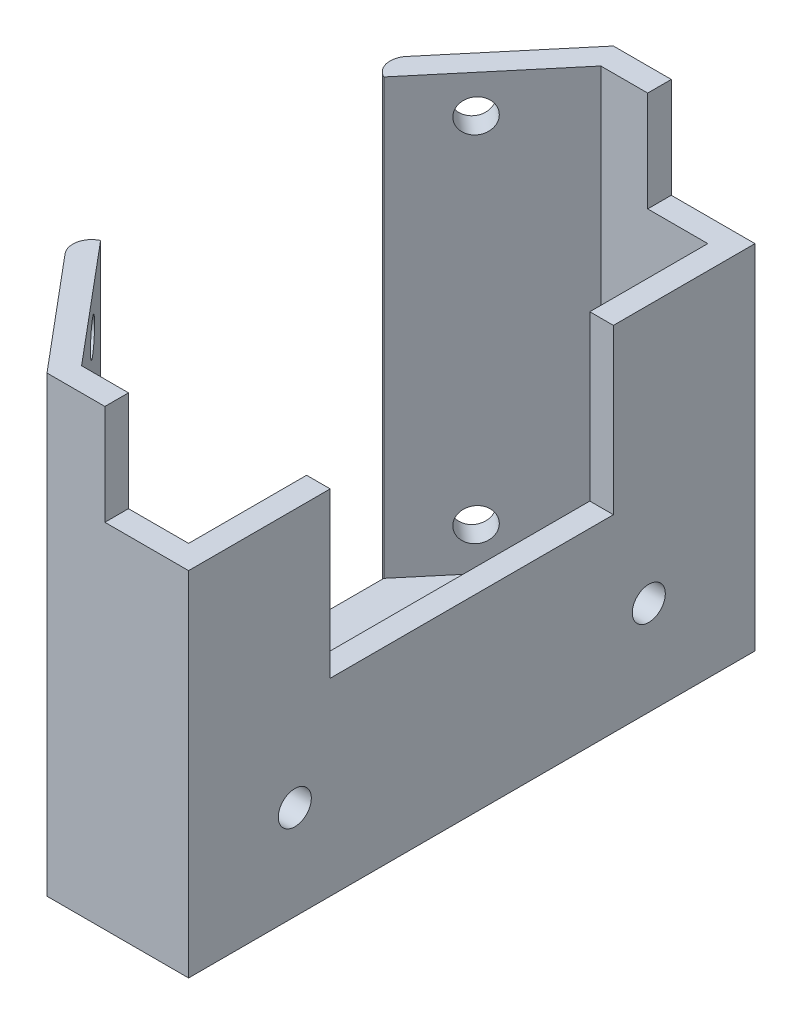
ISO-10303-21;
HEADER;
FILE_DESCRIPTION(('STEP AP214'),'2;1');
FILE_NAME('part.step','',(''),(''),'','','');
FILE_SCHEMA(('AUTOMOTIVE_DESIGN { 1 0 10303 214 1 1 1 1 }'));
ENDSEC;
DATA;
#1=APPLICATION_CONTEXT('core data for automotive mechanical design processes');
#2=APPLICATION_PROTOCOL_DEFINITION('international standard','automotive_design',2000,#1);
#3=PRODUCT_CONTEXT('',#1,'mechanical');
#4=PRODUCT('Part','Part','',(#3));
#5=PRODUCT_RELATED_PRODUCT_CATEGORY('part','',(#4));
#6=PRODUCT_DEFINITION_FORMATION('','',#4);
#7=PRODUCT_DEFINITION_CONTEXT('part definition',#1,'design');
#8=PRODUCT_DEFINITION('design','',#6,#7);
#9=PRODUCT_DEFINITION_SHAPE('','',#8);
#10=(LENGTH_UNIT() NAMED_UNIT(*) SI_UNIT(.MILLI.,.METRE.));
#11=(NAMED_UNIT(*) PLANE_ANGLE_UNIT() SI_UNIT($,.RADIAN.));
#12=(NAMED_UNIT(*) SI_UNIT($,.STERADIAN.) SOLID_ANGLE_UNIT());
#13=UNCERTAINTY_MEASURE_WITH_UNIT(LENGTH_MEASURE(1.E-05),#10,'distance_accuracy_value','');
#14=(GEOMETRIC_REPRESENTATION_CONTEXT(3) GLOBAL_UNCERTAINTY_ASSIGNED_CONTEXT((#13)) GLOBAL_UNIT_ASSIGNED_CONTEXT((#10,
#11,#12)) REPRESENTATION_CONTEXT('',''));
#15=CARTESIAN_POINT('',(0.,0.,0.));
#16=DIRECTION('',(0.,0.,1.));
#17=DIRECTION('',(1.,0.,0.));
#18=AXIS2_PLACEMENT_3D('',#15,#16,#17);
#19=CARTESIAN_POINT('',(-19.1732969614341,55.,16.0883064087919));
#20=DIRECTION('',(0.766044443118976,0.,-0.642787609686541));
#21=DIRECTION('',(-0.642787609686541,0.,-0.766044443118977));
#22=AXIS2_PLACEMENT_3D('',#19,#20,#21);
#23=PLANE('',#22);
#24=CARTESIAN_POINT('',(-14.279396449961,44.,21.9206299251385));
#25=DIRECTION('',(-0.766044443118976,0.,0.642787609686541));
#26=DIRECTION('',(0.642787609686541,0.,0.766044443118976));
#27=AXIS2_PLACEMENT_3D('',#24,#25,#26);
#28=CIRCLE('',#27,1.75);
#29=CARTESIAN_POINT('',(-13.1545181330096,44.,23.2612077005967));
#30=VERTEX_POINT('',#29);
#31=EDGE_CURVE('E239',#30,#30,#28,.T.);
#32=ORIENTED_EDGE('',*,*,#31,.F.);
#33=EDGE_LOOP('',(#32));
#34=FACE_BOUND('',#33,.T.);
#35=DIRECTION('',(0.,-1.,0.));
#36=VECTOR('',#35,1.);
#37=CARTESIAN_POINT('',(-7.49999999999999,55.,30.));
#38=LINE('',#37,#36);
#39=CARTESIAN_POINT('',(-7.49999999999999,48.,30.));
#40=VERTEX_POINT('',#39);
#41=CARTESIAN_POINT('',(-7.49999999999999,0.,30.));
#42=VERTEX_POINT('',#41);
#43=EDGE_CURVE('E326',#40,#42,#38,.T.);
#44=ORIENTED_EDGE('',*,*,#43,.F.);
#45=DIRECTION('',(-0.642787609686541,0.,-0.766044443118977));
#46=VECTOR('',#45,1.);
#47=CARTESIAN_POINT('',(-19.1732969614341,48.,16.0883064087919));
#48=LINE('',#47,#46);
#49=CARTESIAN_POINT('',(-17.4933344983938,48.,18.0904077095436));
#50=VERTEX_POINT('',#49);
#51=EDGE_CURVE('E197',#40,#50,#48,.T.);
#52=ORIENTED_EDGE('',*,*,#51,.T.);
#53=DIRECTION('',(0.,1.,0.));
#54=VECTOR('',#53,1.);
#55=CARTESIAN_POINT('',(-17.4933344983938,55.,18.0904077095436));
#56=LINE('',#55,#54);
#57=CARTESIAN_POINT('',(-17.4933344983938,0.,18.0904077095436));
#58=VERTEX_POINT('',#57);
#59=EDGE_CURVE('E333',#50,#58,#56,.F.);
#60=ORIENTED_EDGE('',*,*,#59,.T.);
#61=DIRECTION('',(0.642787609686541,0.,0.766044443118976));
#62=VECTOR('',#61,1.);
#63=CARTESIAN_POINT('',(-19.1732969614341,0.,16.0883064087919));
#64=LINE('',#63,#62);
#65=EDGE_CURVE('E308',#58,#42,#64,.T.);
#66=ORIENTED_EDGE('',*,*,#65,.T.);
#67=EDGE_LOOP('',(#44,#52,#60,#66));
#68=FACE_BOUND('',#67,.T.);
#69=CARTESIAN_POINT('',(-14.9221840596476,6.51333570454687,21.1545854820195));
#70=DIRECTION('',(0.766044443118976,0.,-0.642787609686541));
#71=DIRECTION('',(-0.642787609686541,0.,-0.766044443118976));
#72=AXIS2_PLACEMENT_3D('',#69,#70,#71);
#73=CIRCLE('',#72,1.75);
#74=CARTESIAN_POINT('',(-16.047062376599,6.51333570454687,19.8140077065613));
#75=VERTEX_POINT('',#74);
#76=EDGE_CURVE('E243',#75,#75,#73,.T.);
#77=ORIENTED_EDGE('',*,*,#76,.T.);
#78=EDGE_LOOP('',(#77));
#79=FACE_BOUND('',#78,.T.);
#80=ADVANCED_FACE('F36',(#34,#68,#79),#23,.F.);
#81=CARTESIAN_POINT('',(-17.2581858536367,2.,14.4813373845755));
#82=DIRECTION('',(-0.766044443118977,0.,0.642787609686541));
#83=DIRECTION('',(0.642787609686541,0.,0.766044443118977));
#84=AXIS2_PLACEMENT_3D('',#81,#82,#83);
#85=PLANE('',#84);
#86=CARTESIAN_POINT('',(-12.3642853421636,44.,20.3136609009222));
#87=DIRECTION('',(-0.766044443118977,0.,0.642787609686541));
#88=DIRECTION('',(0.642787609686541,0.,0.766044443118977));
#89=AXIS2_PLACEMENT_3D('',#86,#87,#88);
#90=CIRCLE('',#89,1.75);
#91=CARTESIAN_POINT('',(-11.2394070252122,44.,21.6542386763804));
#92=VERTEX_POINT('',#91);
#93=EDGE_CURVE('E242',#92,#92,#90,.T.);
#94=ORIENTED_EDGE('',*,*,#93,.T.);
#95=EDGE_LOOP('',(#94));
#96=FACE_BOUND('',#95,.T.);
#97=DIRECTION('',(0.,1.,0.));
#98=VECTOR('',#97,1.);
#99=CARTESIAN_POINT('',(-16.8229762443285,2.,15.));
#100=LINE('',#99,#98);
#101=CARTESIAN_POINT('',(-16.8229762443285,2.,15.));
#102=VERTEX_POINT('',#101);
#103=CARTESIAN_POINT('',(-16.8229762443285,48.,15.));
#104=VERTEX_POINT('',#103);
#105=EDGE_CURVE('E328',#102,#104,#100,.T.);
#106=ORIENTED_EDGE('',*,*,#105,.T.);
#107=DIRECTION('',(0.642787609686541,0.,0.766044443118977));
#108=VECTOR('',#107,1.);
#109=CARTESIAN_POINT('',(-17.2581858536367,48.,14.4813373845755));
#110=LINE('',#109,#108);
#111=CARTESIAN_POINT('',(-6.3342308546125,48.,27.5));
#112=VERTEX_POINT('',#111);
#113=EDGE_CURVE('E217',#104,#112,#110,.T.);
#114=ORIENTED_EDGE('',*,*,#113,.T.);
#115=DIRECTION('',(0.,1.,0.));
#116=VECTOR('',#115,1.);
#117=CARTESIAN_POINT('',(-6.3342308546125,2.,27.5));
#118=LINE('',#117,#116);
#119=CARTESIAN_POINT('',(-6.3342308546125,2.,27.5));
#120=VERTEX_POINT('',#119);
#121=EDGE_CURVE('E293',#120,#112,#118,.T.);
#122=ORIENTED_EDGE('',*,*,#121,.F.);
#123=DIRECTION('',(0.642787609686541,0.,0.766044443118977));
#124=VECTOR('',#123,1.);
#125=CARTESIAN_POINT('',(-17.2581858536367,2.,14.4813373845755));
#126=LINE('',#125,#124);
#127=EDGE_CURVE('E283',#102,#120,#126,.T.);
#128=ORIENTED_EDGE('',*,*,#127,.F.);
#129=EDGE_LOOP('',(#106,#114,#122,#128));
#130=FACE_BOUND('',#129,.T.);
#131=CARTESIAN_POINT('',(-13.0070729518501,6.51333570454687,19.5476164578032));
#132=DIRECTION('',(-0.766044443118977,0.,0.642787609686541));
#133=DIRECTION('',(0.642787609686541,0.,0.766044443118977));
#134=AXIS2_PLACEMENT_3D('',#131,#132,#133);
#135=CIRCLE('',#134,1.75);
#136=CARTESIAN_POINT('',(-11.8821946348987,6.51333570454687,20.8881942332614));
#137=VERTEX_POINT('',#136);
#138=EDGE_CURVE('E246',#137,#137,#135,.F.);
#139=ORIENTED_EDGE('',*,*,#138,.F.);
#140=EDGE_LOOP('',(#139));
#141=FACE_BOUND('',#140,.T.);
#142=ADVANCED_FACE('F389',(#96,#130,#141),#85,.F.);
#143=CARTESIAN_POINT('',(-19.1732969614341,55.,-16.0883064087919));
#144=DIRECTION('',(0.766044443118977,0.,0.642787609686541));
#145=DIRECTION('',(0.642787609686541,0.,-0.766044443118977));
#146=AXIS2_PLACEMENT_3D('',#143,#144,#145);
#147=PLANE('',#146);
#148=CARTESIAN_POINT('',(-14.2793964499611,6.5,-21.9206299251385));
#149=DIRECTION('',(-0.766044443118977,0.,-0.642787609686541));
#150=DIRECTION('',(-0.642787609686541,0.,0.766044443118977));
#151=AXIS2_PLACEMENT_3D('',#148,#149,#150);
#152=CIRCLE('',#151,1.75);
#153=CARTESIAN_POINT('',(-15.4042747669125,6.5,-20.5800521496803));
#154=VERTEX_POINT('',#153);
#155=EDGE_CURVE('E231',#154,#154,#152,.T.);
#156=ORIENTED_EDGE('',*,*,#155,.F.);
#157=EDGE_LOOP('',(#156));
#158=FACE_BOUND('',#157,.T.);
#159=CARTESIAN_POINT('',(-14.2793964499611,44.,-21.9206299251385));
#160=DIRECTION('',(-0.766044443118977,0.,-0.642787609686541));
#161=DIRECTION('',(-0.642787609686541,0.,0.766044443118977));
#162=AXIS2_PLACEMENT_3D('',#159,#160,#161);
#163=CIRCLE('',#162,1.75000000000001);
#164=CARTESIAN_POINT('',(-15.4042747669125,44.,-20.5800521496803));
#165=VERTEX_POINT('',#164);
#166=EDGE_CURVE('E235',#165,#165,#163,.T.);
#167=ORIENTED_EDGE('',*,*,#166,.F.);
#168=EDGE_LOOP('',(#167));
#169=FACE_BOUND('',#168,.T.);
#170=DIRECTION('',(0.,-1.,0.));
#171=VECTOR('',#170,1.);
#172=CARTESIAN_POINT('',(-17.4933344983938,55.,-18.0904077095436));
#173=LINE('',#172,#171);
#174=CARTESIAN_POINT('',(-17.4933344983938,0.,-18.0904077095436));
#175=VERTEX_POINT('',#174);
#176=CARTESIAN_POINT('',(-17.4933344983938,48.,-18.0904077095436));
#177=VERTEX_POINT('',#176);
#178=EDGE_CURVE('E339',#175,#177,#173,.F.);
#179=ORIENTED_EDGE('',*,*,#178,.T.);
#180=DIRECTION('',(0.642787609686541,0.,-0.766044443118977));
#181=VECTOR('',#180,1.);
#182=CARTESIAN_POINT('',(-19.1732969614341,48.,-16.0883064087919));
#183=LINE('',#182,#181);
#184=CARTESIAN_POINT('',(-7.49999999999999,48.,-30.));
#185=VERTEX_POINT('',#184);
#186=EDGE_CURVE('E210',#177,#185,#183,.T.);
#187=ORIENTED_EDGE('',*,*,#186,.T.);
#188=DIRECTION('',(0.,-1.,0.));
#189=VECTOR('',#188,1.);
#190=CARTESIAN_POINT('',(-7.49999999999999,55.,-30.));
#191=LINE('',#190,#189);
#192=CARTESIAN_POINT('',(-7.49999999999999,0.,-30.));
#193=VERTEX_POINT('',#192);
#194=EDGE_CURVE('E320',#185,#193,#191,.T.);
#195=ORIENTED_EDGE('',*,*,#194,.T.);
#196=DIRECTION('',(-0.642787609686541,0.,0.766044443118977));
#197=VECTOR('',#196,1.);
#198=CARTESIAN_POINT('',(-19.1732969614341,0.,-16.0883064087919));
#199=LINE('',#198,#197);
#200=EDGE_CURVE('E297',#193,#175,#199,.T.);
#201=ORIENTED_EDGE('',*,*,#200,.T.);
#202=EDGE_LOOP('',(#179,#187,#195,#201));
#203=FACE_BOUND('',#202,.T.);
#204=ADVANCED_FACE('F412',(#158,#169,#203),#147,.F.);
#205=CARTESIAN_POINT('',(0.,55.,30.));
#206=DIRECTION('',(0.,0.,-1.));
#207=DIRECTION('',(-1.,0.,0.));
#208=AXIS2_PLACEMENT_3D('',#205,#206,#207);
#209=PLANE('',#208);
#210=DIRECTION('',(0.,-1.,0.));
#211=VECTOR('',#210,1.);
#212=CARTESIAN_POINT('',(7.5,55.,30.));
#213=LINE('',#212,#211);
#214=CARTESIAN_POINT('',(7.50000000000001,37.3717761098646,30.));
#215=VERTEX_POINT('',#214);
#216=CARTESIAN_POINT('',(7.5,0.,30.));
#217=VERTEX_POINT('',#216);
#218=EDGE_CURVE('E324',#215,#217,#213,.T.);
#219=ORIENTED_EDGE('',*,*,#218,.F.);
#220=DIRECTION('',(1.,0.,0.));
#221=VECTOR('',#220,1.);
#222=CARTESIAN_POINT('',(-1.36754643088466,37.3717761098646,30.));
#223=LINE('',#222,#221);
#224=CARTESIAN_POINT('',(-1.36754643088466,37.3717761098646,30.));
#225=VERTEX_POINT('',#224);
#226=EDGE_CURVE('E193',#225,#215,#223,.T.);
#227=ORIENTED_EDGE('',*,*,#226,.F.);
#228=DIRECTION('',(0.,-1.,0.));
#229=VECTOR('',#228,1.);
#230=CARTESIAN_POINT('',(-1.36754643088466,48.,30.));
#231=LINE('',#230,#229);
#232=CARTESIAN_POINT('',(-1.36754643088466,48.,30.));
#233=VERTEX_POINT('',#232);
#234=EDGE_CURVE('E181',#233,#225,#231,.T.);
#235=ORIENTED_EDGE('',*,*,#234,.F.);
#236=DIRECTION('',(1.,0.,0.));
#237=VECTOR('',#236,1.);
#238=CARTESIAN_POINT('',(-17.9612456121558,48.,30.));
#239=LINE('',#238,#237);
#240=EDGE_CURVE('E191',#40,#233,#239,.T.);
#241=ORIENTED_EDGE('',*,*,#240,.F.);
#242=ORIENTED_EDGE('',*,*,#43,.T.);
#243=DIRECTION('',(1.,0.,0.));
#244=VECTOR('',#243,1.);
#245=CARTESIAN_POINT('',(0.,0.,30.));
#246=LINE('',#245,#244);
#247=EDGE_CURVE('E311',#42,#217,#246,.T.);
#248=ORIENTED_EDGE('',*,*,#247,.T.);
#249=EDGE_LOOP('',(#219,#227,#235,#241,#242,#248));
#250=FACE_BOUND('',#249,.T.);
#251=ADVANCED_FACE('F190',(#250),#209,.F.);
#252=CARTESIAN_POINT('',(7.5,55.,0.));
#253=DIRECTION('',(1.,0.,0.));
#254=DIRECTION('',(0.,0.,-1.));
#255=AXIS2_PLACEMENT_3D('',#252,#253,#254);
#256=PLANE('',#255);
#257=DIRECTION('',(0.,0.,1.));
#258=VECTOR('',#257,1.);
#259=CARTESIAN_POINT('',(7.50000000000001,37.3717761098646,-48.));
#260=LINE('',#259,#258);
#261=CARTESIAN_POINT('',(7.50000000000001,37.3717761098646,15.));
#262=VERTEX_POINT('',#261);
#263=EDGE_CURVE('E421',#262,#215,#260,.T.);
#264=ORIENTED_EDGE('',*,*,#263,.T.);
#265=ORIENTED_EDGE('',*,*,#218,.T.);
#266=DIRECTION('',(0.,0.,1.));
#267=VECTOR('',#266,1.);
#268=CARTESIAN_POINT('',(7.5,0.,0.));
#269=LINE('',#268,#267);
#270=CARTESIAN_POINT('',(7.50000000000001,0.,-30.));
#271=VERTEX_POINT('',#270);
#272=EDGE_CURVE('E314',#271,#217,#269,.T.);
#273=ORIENTED_EDGE('',*,*,#272,.F.);
#274=DIRECTION('',(0.,-1.,0.));
#275=VECTOR('',#274,1.);
#276=CARTESIAN_POINT('',(7.50000000000001,55.,-30.));
#277=LINE('',#276,#275);
#278=CARTESIAN_POINT('',(7.50000000000001,37.3717761098646,-30.));
#279=VERTEX_POINT('',#278);
#280=EDGE_CURVE('E322',#279,#271,#277,.T.);
#281=ORIENTED_EDGE('',*,*,#280,.F.);
#282=CARTESIAN_POINT('',(7.50000000000001,37.3717761098646,-15.));
#283=VERTEX_POINT('',#282);
#284=EDGE_CURVE('E718',#279,#283,#260,.T.);
#285=ORIENTED_EDGE('',*,*,#284,.T.);
#286=DIRECTION('',(0.,1.,0.));
#287=VECTOR('',#286,1.);
#288=CARTESIAN_POINT('',(7.5,55.,-15.));
#289=LINE('',#288,#287);
#290=CARTESIAN_POINT('',(7.5,20.,-15.));
#291=VERTEX_POINT('',#290);
#292=EDGE_CURVE('E278',#291,#283,#289,.T.);
#293=ORIENTED_EDGE('',*,*,#292,.F.);
#294=DIRECTION('',(0.,0.,1.));
#295=VECTOR('',#294,1.);
#296=CARTESIAN_POINT('',(7.5,20.,0.));
#297=LINE('',#296,#295);
#298=CARTESIAN_POINT('',(7.5,20.,15.));
#299=VERTEX_POINT('',#298);
#300=EDGE_CURVE('E267',#291,#299,#297,.T.);
#301=ORIENTED_EDGE('',*,*,#300,.T.);
#302=DIRECTION('',(0.,-1.,0.));
#303=VECTOR('',#302,1.);
#304=CARTESIAN_POINT('',(7.5,55.,15.));
#305=LINE('',#304,#303);
#306=EDGE_CURVE('E273',#262,#299,#305,.T.);
#307=ORIENTED_EDGE('',*,*,#306,.F.);
#308=EDGE_LOOP('',(#264,#265,#273,#281,#285,#293,#301,#307));
#309=FACE_BOUND('',#308,.T.);
#310=CARTESIAN_POINT('',(7.5,10.,18.75));
#311=DIRECTION('',(1.,0.,0.));
#312=DIRECTION('',(0.,0.,1.));
#313=AXIS2_PLACEMENT_3D('',#310,#311,#312);
#314=CIRCLE('',#313,1.75);
#315=CARTESIAN_POINT('',(7.5,10.,20.5));
#316=VERTEX_POINT('',#315);
#317=EDGE_CURVE('E223',#316,#316,#314,.T.);
#318=ORIENTED_EDGE('',*,*,#317,.F.);
#319=EDGE_LOOP('',(#318));
#320=FACE_BOUND('',#319,.T.);
#321=CARTESIAN_POINT('',(7.5,10.,-18.75));
#322=DIRECTION('',(1.,0.,0.));
#323=DIRECTION('',(0.,0.,-1.));
#324=AXIS2_PLACEMENT_3D('',#321,#322,#323);
#325=CIRCLE('',#324,1.75);
#326=CARTESIAN_POINT('',(7.5,10.,-20.5));
#327=VERTEX_POINT('',#326);
#328=EDGE_CURVE('E227',#327,#327,#325,.T.);
#329=ORIENTED_EDGE('',*,*,#328,.F.);
#330=EDGE_LOOP('',(#329));
#331=FACE_BOUND('',#330,.T.);
#332=ADVANCED_FACE('F417',(#309,#320,#331),#256,.T.);
#333=CARTESIAN_POINT('',(0.,55.,-30.));
#334=DIRECTION('',(0.,0.,-1.));
#335=DIRECTION('',(-1.,0.,0.));
#336=AXIS2_PLACEMENT_3D('',#333,#334,#335);
#337=PLANE('',#336);
#338=DIRECTION('',(-1.,0.,0.));
#339=VECTOR('',#338,1.);
#340=CARTESIAN_POINT('',(0.,37.3717761098646,-30.));
#341=LINE('',#340,#339);
#342=CARTESIAN_POINT('',(-1.36754643088466,37.3717761098646,-30.));
#343=VERTEX_POINT('',#342);
#344=EDGE_CURVE('E716',#279,#343,#341,.T.);
#345=ORIENTED_EDGE('',*,*,#344,.F.);
#346=ORIENTED_EDGE('',*,*,#280,.T.);
#347=DIRECTION('',(1.,0.,0.));
#348=VECTOR('',#347,1.);
#349=CARTESIAN_POINT('',(0.,0.,-30.));
#350=LINE('',#349,#348);
#351=EDGE_CURVE('E317',#193,#271,#350,.T.);
#352=ORIENTED_EDGE('',*,*,#351,.F.);
#353=ORIENTED_EDGE('',*,*,#194,.F.);
#354=DIRECTION('',(1.,0.,0.));
#355=VECTOR('',#354,1.);
#356=CARTESIAN_POINT('',(-17.9612456121558,48.,-30.));
#357=LINE('',#356,#355);
#358=CARTESIAN_POINT('',(-1.36754643088466,48.,-30.));
#359=VERTEX_POINT('',#358);
#360=EDGE_CURVE('E198',#185,#359,#357,.T.);
#361=ORIENTED_EDGE('',*,*,#360,.T.);
#362=DIRECTION('',(0.,1.,0.));
#363=VECTOR('',#362,1.);
#364=CARTESIAN_POINT('',(-1.36754643088466,55.,-30.));
#365=LINE('',#364,#363);
#366=EDGE_CURVE('E51',#343,#359,#365,.T.);
#367=ORIENTED_EDGE('',*,*,#366,.F.);
#368=EDGE_LOOP('',(#345,#346,#352,#353,#361,#367));
#369=FACE_BOUND('',#368,.T.);
#370=ADVANCED_FACE('F409',(#369),#337,.T.);
#371=CARTESIAN_POINT('',(0.,0.,0.));
#372=DIRECTION('',(0.,1.,0.));
#373=DIRECTION('',(0.,0.,1.));
#374=AXIS2_PLACEMENT_3D('',#371,#372,#373);
#375=PLANE('',#374);
#376=CARTESIAN_POINT('',(-0.667115427306265,0.,-23.5));
#377=DIRECTION('',(0.,1.,0.));
#378=DIRECTION('',(0.,0.,1.));
#379=AXIS2_PLACEMENT_3D('',#376,#377,#378);
#380=CIRCLE('',#379,1.75);
#381=CARTESIAN_POINT('',(-0.667115427306265,0.,-21.75));
#382=VERTEX_POINT('',#381);
#383=EDGE_CURVE('E739',#382,#382,#380,.T.);
#384=ORIENTED_EDGE('',*,*,#383,.T.);
#385=EDGE_LOOP('',(#384));
#386=FACE_BOUND('',#385,.T.);
#387=CARTESIAN_POINT('',(-0.667115427306259,0.,23.5));
#388=DIRECTION('',(0.,1.,0.));
#389=DIRECTION('',(0.,0.,1.));
#390=AXIS2_PLACEMENT_3D('',#387,#388,#389);
#391=CIRCLE('',#390,1.75);
#392=CARTESIAN_POINT('',(-0.667115427306259,0.,25.25));
#393=VERTEX_POINT('',#392);
#394=EDGE_CURVE('E199',#393,#393,#391,.T.);
#395=ORIENTED_EDGE('',*,*,#394,.T.);
#396=EDGE_LOOP('',(#395));
#397=FACE_BOUND('',#396,.T.);
#398=ORIENTED_EDGE('',*,*,#65,.F.);
#399=CARTESIAN_POINT('',(-15.9612456121558,0.,16.8048324901705));
#400=DIRECTION('',(0.,1.,0.));
#401=DIRECTION('',(0.,0.,1.));
#402=AXIS2_PLACEMENT_3D('',#399,#400,#401);
#403=CIRCLE('',#402,2.);
#404=CARTESIAN_POINT('',(-16.8229762443285,0.,15.));
#405=VERTEX_POINT('',#404);
#406=EDGE_CURVE('E337',#58,#405,#403,.F.);
#407=ORIENTED_EDGE('',*,*,#406,.T.);
#408=DIRECTION('',(0.,0.,-1.));
#409=VECTOR('',#408,1.);
#410=CARTESIAN_POINT('',(-16.8229762443285,0.,0.));
#411=LINE('',#410,#409);
#412=CARTESIAN_POINT('',(-16.8229762443285,0.,-15.));
#413=VERTEX_POINT('',#412);
#414=EDGE_CURVE('E255',#405,#413,#411,.T.);
#415=ORIENTED_EDGE('',*,*,#414,.T.);
#416=CARTESIAN_POINT('',(-15.9612456121558,0.,-16.8048324901705));
#417=DIRECTION('',(0.,1.,0.));
#418=DIRECTION('',(0.,0.,1.));
#419=AXIS2_PLACEMENT_3D('',#416,#417,#418);
#420=CIRCLE('',#419,2.);
#421=EDGE_CURVE('E335',#413,#175,#420,.F.);
#422=ORIENTED_EDGE('',*,*,#421,.T.);
#423=ORIENTED_EDGE('',*,*,#200,.F.);
#424=ORIENTED_EDGE('',*,*,#351,.T.);
#425=ORIENTED_EDGE('',*,*,#272,.T.);
#426=ORIENTED_EDGE('',*,*,#247,.F.);
#427=EDGE_LOOP('',(#398,#407,#415,#422,#423,#424,#425,#426));
#428=FACE_BOUND('',#427,.T.);
#429=ADVANCED_FACE('F374',(#386,#397,#428),#375,.F.);
#430=CARTESIAN_POINT('',(-17.2581858536367,2.,-14.4813373845755));
#431=DIRECTION('',(0.766044443118977,0.,0.642787609686541));
#432=DIRECTION('',(0.642787609686541,0.,-0.766044443118977));
#433=AXIS2_PLACEMENT_3D('',#430,#431,#432);
#434=PLANE('',#433);
#435=DIRECTION('',(0.642787609686541,0.,-0.766044443118977));
#436=VECTOR('',#435,1.);
#437=CARTESIAN_POINT('',(-17.2581858536367,48.,-14.4813373845755));
#438=LINE('',#437,#436);
#439=CARTESIAN_POINT('',(-16.8229762443285,48.,-15.));
#440=VERTEX_POINT('',#439);
#441=CARTESIAN_POINT('',(-6.3342308546125,48.,-27.5));
#442=VERTEX_POINT('',#441);
#443=EDGE_CURVE('E202',#440,#442,#438,.T.);
#444=ORIENTED_EDGE('',*,*,#443,.F.);
#445=DIRECTION('',(0.,1.,0.));
#446=VECTOR('',#445,1.);
#447=CARTESIAN_POINT('',(-16.8229762443285,2.,-15.));
#448=LINE('',#447,#446);
#449=CARTESIAN_POINT('',(-16.8229762443285,2.,-15.));
#450=VERTEX_POINT('',#449);
#451=EDGE_CURVE('E275',#450,#440,#448,.T.);
#452=ORIENTED_EDGE('',*,*,#451,.F.);
#453=DIRECTION('',(0.642787609686541,0.,-0.766044443118977));
#454=VECTOR('',#453,1.);
#455=CARTESIAN_POINT('',(-17.2581858536367,2.,-14.4813373845755));
#456=LINE('',#455,#454);
#457=CARTESIAN_POINT('',(-6.3342308546125,2.,-27.5));
#458=VERTEX_POINT('',#457);
#459=EDGE_CURVE('E281',#450,#458,#456,.T.);
#460=ORIENTED_EDGE('',*,*,#459,.T.);
#461=DIRECTION('',(0.,1.,0.));
#462=VECTOR('',#461,1.);
#463=CARTESIAN_POINT('',(-6.3342308546125,2.,-27.5));
#464=LINE('',#463,#462);
#465=EDGE_CURVE('E294',#458,#442,#464,.T.);
#466=ORIENTED_EDGE('',*,*,#465,.T.);
#467=EDGE_LOOP('',(#444,#452,#460,#466));
#468=FACE_BOUND('',#467,.T.);
#469=CARTESIAN_POINT('',(-12.3642853421636,6.5,-20.3136609009221));
#470=DIRECTION('',(0.766044443118977,0.,0.642787609686541));
#471=DIRECTION('',(0.642787609686541,0.,-0.766044443118977));
#472=AXIS2_PLACEMENT_3D('',#469,#470,#471);
#473=CIRCLE('',#472,1.75);
#474=CARTESIAN_POINT('',(-11.2394070252122,6.5,-21.6542386763804));
#475=VERTEX_POINT('',#474);
#476=EDGE_CURVE('E234',#475,#475,#473,.T.);
#477=ORIENTED_EDGE('',*,*,#476,.F.);
#478=EDGE_LOOP('',(#477));
#479=FACE_BOUND('',#478,.T.);
#480=CARTESIAN_POINT('',(-12.3642853421636,44.,-20.3136609009222));
#481=DIRECTION('',(0.766044443118977,0.,0.642787609686541));
#482=DIRECTION('',(0.642787609686541,0.,-0.766044443118977));
#483=AXIS2_PLACEMENT_3D('',#480,#481,#482);
#484=CIRCLE('',#483,1.75000000000001);
#485=CARTESIAN_POINT('',(-11.2394070252122,44.,-21.6542386763804));
#486=VERTEX_POINT('',#485);
#487=EDGE_CURVE('E238',#486,#486,#484,.T.);
#488=ORIENTED_EDGE('',*,*,#487,.F.);
#489=EDGE_LOOP('',(#488));
#490=FACE_BOUND('',#489,.T.);
#491=ADVANCED_FACE('F362',(#468,#479,#490),#434,.T.);
#492=CARTESIAN_POINT('',(0.,2.,-27.5));
#493=DIRECTION('',(0.,0.,-1.));
#494=DIRECTION('',(-1.,0.,0.));
#495=AXIS2_PLACEMENT_3D('',#492,#493,#494);
#496=PLANE('',#495);
#497=DIRECTION('',(0.,1.,0.));
#498=VECTOR('',#497,1.);
#499=CARTESIAN_POINT('',(5.,2.,-27.5));
#500=LINE('',#499,#498);
#501=CARTESIAN_POINT('',(5.,2.,-27.5));
#502=VERTEX_POINT('',#501);
#503=CARTESIAN_POINT('',(5.,37.3717761098646,-27.5));
#504=VERTEX_POINT('',#503);
#505=EDGE_CURVE('E298',#502,#504,#500,.T.);
#506=ORIENTED_EDGE('',*,*,#505,.T.);
#507=DIRECTION('',(-1.,0.,0.));
#508=VECTOR('',#507,1.);
#509=CARTESIAN_POINT('',(0.,37.3717761098646,-27.5));
#510=LINE('',#509,#508);
#511=CARTESIAN_POINT('',(-1.36754643088466,37.3717761098646,-27.5));
#512=VERTEX_POINT('',#511);
#513=EDGE_CURVE('E730',#504,#512,#510,.T.);
#514=ORIENTED_EDGE('',*,*,#513,.T.);
#515=DIRECTION('',(0.,1.,0.));
#516=VECTOR('',#515,1.);
#517=CARTESIAN_POINT('',(-1.36754643088466,2.,-27.5));
#518=LINE('',#517,#516);
#519=CARTESIAN_POINT('',(-1.36754643088466,48.,-27.5));
#520=VERTEX_POINT('',#519);
#521=EDGE_CURVE('E402',#512,#520,#518,.T.);
#522=ORIENTED_EDGE('',*,*,#521,.T.);
#523=DIRECTION('',(-1.,0.,0.));
#524=VECTOR('',#523,1.);
#525=CARTESIAN_POINT('',(0.,48.,-27.5));
#526=LINE('',#525,#524);
#527=EDGE_CURVE('E213',#520,#442,#526,.T.);
#528=ORIENTED_EDGE('',*,*,#527,.T.);
#529=ORIENTED_EDGE('',*,*,#465,.F.);
#530=DIRECTION('',(-1.,0.,0.));
#531=VECTOR('',#530,1.);
#532=CARTESIAN_POINT('',(0.,2.,-27.5));
#533=LINE('',#532,#531);
#534=EDGE_CURVE('E290',#502,#458,#533,.T.);
#535=ORIENTED_EDGE('',*,*,#534,.F.);
#536=EDGE_LOOP('',(#506,#514,#522,#528,#529,#535));
#537=FACE_BOUND('',#536,.T.);
#538=ADVANCED_FACE('F399',(#537),#496,.F.);
#539=CARTESIAN_POINT('',(5.,2.,0.));
#540=DIRECTION('',(-1.,0.,0.));
#541=DIRECTION('',(0.,0.,1.));
#542=AXIS2_PLACEMENT_3D('',#539,#540,#541);
#543=PLANE('',#542);
#544=DIRECTION('',(0.,0.,1.));
#545=VECTOR('',#544,1.);
#546=CARTESIAN_POINT('',(5.,37.3717761098646,0.));
#547=LINE('',#546,#545);
#548=CARTESIAN_POINT('',(5.,37.3717761098646,-15.));
#549=VERTEX_POINT('',#548);
#550=EDGE_CURVE('E490',#504,#549,#547,.T.);
#551=ORIENTED_EDGE('',*,*,#550,.F.);
#552=ORIENTED_EDGE('',*,*,#505,.F.);
#553=DIRECTION('',(0.,0.,1.));
#554=VECTOR('',#553,1.);
#555=CARTESIAN_POINT('',(5.,2.,0.));
#556=LINE('',#555,#554);
#557=CARTESIAN_POINT('',(5.,2.,27.5));
#558=VERTEX_POINT('',#557);
#559=EDGE_CURVE('E288',#502,#558,#556,.T.);
#560=ORIENTED_EDGE('',*,*,#559,.T.);
#561=DIRECTION('',(0.,1.,0.));
#562=VECTOR('',#561,1.);
#563=CARTESIAN_POINT('',(5.,2.,27.5));
#564=LINE('',#563,#562);
#565=CARTESIAN_POINT('',(5.,37.3717761098646,27.5));
#566=VERTEX_POINT('',#565);
#567=EDGE_CURVE('E301',#558,#566,#564,.T.);
#568=ORIENTED_EDGE('',*,*,#567,.T.);
#569=CARTESIAN_POINT('',(5.,37.3717761098646,15.));
#570=VERTEX_POINT('',#569);
#571=EDGE_CURVE('E731',#570,#566,#547,.T.);
#572=ORIENTED_EDGE('',*,*,#571,.F.);
#573=DIRECTION('',(0.,1.,0.));
#574=VECTOR('',#573,1.);
#575=CARTESIAN_POINT('',(5.,2.,15.));
#576=LINE('',#575,#574);
#577=CARTESIAN_POINT('',(5.,20.,15.));
#578=VERTEX_POINT('',#577);
#579=EDGE_CURVE('E270',#578,#570,#576,.T.);
#580=ORIENTED_EDGE('',*,*,#579,.F.);
#581=DIRECTION('',(0.,0.,-1.));
#582=VECTOR('',#581,1.);
#583=CARTESIAN_POINT('',(5.,20.,0.));
#584=LINE('',#583,#582);
#585=CARTESIAN_POINT('',(5.,20.,-15.));
#586=VERTEX_POINT('',#585);
#587=EDGE_CURVE('E264',#578,#586,#584,.T.);
#588=ORIENTED_EDGE('',*,*,#587,.T.);
#589=DIRECTION('',(0.,-1.,0.));
#590=VECTOR('',#589,1.);
#591=CARTESIAN_POINT('',(5.,2.,-15.));
#592=LINE('',#591,#590);
#593=EDGE_CURVE('E331',#549,#586,#592,.T.);
#594=ORIENTED_EDGE('',*,*,#593,.F.);
#595=EDGE_LOOP('',(#551,#552,#560,#568,#572,#580,#588,#594));
#596=FACE_BOUND('',#595,.T.);
#597=CARTESIAN_POINT('',(5.,10.,18.75));
#598=DIRECTION('',(-1.,0.,0.));
#599=DIRECTION('',(0.,0.,1.));
#600=AXIS2_PLACEMENT_3D('',#597,#598,#599);
#601=CIRCLE('',#600,1.75);
#602=CARTESIAN_POINT('',(5.,10.,20.5));
#603=VERTEX_POINT('',#602);
#604=EDGE_CURVE('E226',#603,#603,#601,.T.);
#605=ORIENTED_EDGE('',*,*,#604,.F.);
#606=EDGE_LOOP('',(#605));
#607=FACE_BOUND('',#606,.T.);
#608=CARTESIAN_POINT('',(5.,10.,-18.75));
#609=DIRECTION('',(-1.,0.,0.));
#610=DIRECTION('',(0.,0.,1.));
#611=AXIS2_PLACEMENT_3D('',#608,#609,#610);
#612=CIRCLE('',#611,1.75);
#613=CARTESIAN_POINT('',(5.,10.,-17.));
#614=VERTEX_POINT('',#613);
#615=EDGE_CURVE('E230',#614,#614,#612,.T.);
#616=ORIENTED_EDGE('',*,*,#615,.F.);
#617=EDGE_LOOP('',(#616));
#618=FACE_BOUND('',#617,.T.);
#619=ADVANCED_FACE('F482',(#596,#607,#618),#543,.T.);
#620=CARTESIAN_POINT('',(0.,2.,27.5));
#621=DIRECTION('',(0.,0.,-1.));
#622=DIRECTION('',(-1.,0.,0.));
#623=AXIS2_PLACEMENT_3D('',#620,#621,#622);
#624=PLANE('',#623);
#625=DIRECTION('',(-1.,0.,0.));
#626=VECTOR('',#625,1.);
#627=CARTESIAN_POINT('',(0.,37.3717761098646,27.5));
#628=LINE('',#627,#626);
#629=CARTESIAN_POINT('',(-1.36754643088466,37.3717761098646,27.5));
#630=VERTEX_POINT('',#629);
#631=EDGE_CURVE('E720',#566,#630,#628,.T.);
#632=ORIENTED_EDGE('',*,*,#631,.F.);
#633=ORIENTED_EDGE('',*,*,#567,.F.);
#634=DIRECTION('',(-1.,0.,0.));
#635=VECTOR('',#634,1.);
#636=CARTESIAN_POINT('',(0.,2.,27.5));
#637=LINE('',#636,#635);
#638=EDGE_CURVE('E285',#558,#120,#637,.T.);
#639=ORIENTED_EDGE('',*,*,#638,.T.);
#640=ORIENTED_EDGE('',*,*,#121,.T.);
#641=DIRECTION('',(-1.,0.,0.));
#642=VECTOR('',#641,1.);
#643=CARTESIAN_POINT('',(0.,48.,27.5));
#644=LINE('',#643,#642);
#645=CARTESIAN_POINT('',(-1.36754643088466,48.,27.5));
#646=VERTEX_POINT('',#645);
#647=EDGE_CURVE('E221',#646,#112,#644,.T.);
#648=ORIENTED_EDGE('',*,*,#647,.F.);
#649=DIRECTION('',(0.,1.,0.));
#650=VECTOR('',#649,1.);
#651=CARTESIAN_POINT('',(-1.36754643088466,2.,27.5));
#652=LINE('',#651,#650);
#653=EDGE_CURVE('E59',#630,#646,#652,.T.);
#654=ORIENTED_EDGE('',*,*,#653,.F.);
#655=EDGE_LOOP('',(#632,#633,#639,#640,#648,#654));
#656=FACE_BOUND('',#655,.T.);
#657=ADVANCED_FACE('F393',(#656),#624,.T.);
#658=CARTESIAN_POINT('',(0.,2.,0.));
#659=DIRECTION('',(0.,1.,0.));
#660=DIRECTION('',(0.,0.,1.));
#661=AXIS2_PLACEMENT_3D('',#658,#659,#660);
#662=PLANE('',#661);
#663=CARTESIAN_POINT('',(-0.667115427306265,2.,-23.5));
#664=DIRECTION('',(0.,1.,0.));
#665=DIRECTION('',(0.,0.,1.));
#666=AXIS2_PLACEMENT_3D('',#663,#664,#665);
#667=CIRCLE('',#666,1.75);
#668=CARTESIAN_POINT('',(-0.667115427306265,2.,-21.75));
#669=VERTEX_POINT('',#668);
#670=EDGE_CURVE('E719',#669,#669,#667,.T.);
#671=ORIENTED_EDGE('',*,*,#670,.F.);
#672=EDGE_LOOP('',(#671));
#673=FACE_BOUND('',#672,.T.);
#674=CARTESIAN_POINT('',(-0.667115427306259,2.,23.5));
#675=DIRECTION('',(0.,1.,0.));
#676=DIRECTION('',(0.,0.,1.));
#677=AXIS2_PLACEMENT_3D('',#674,#675,#676);
#678=CIRCLE('',#677,1.75);
#679=CARTESIAN_POINT('',(-0.667115427306259,2.,25.25));
#680=VERTEX_POINT('',#679);
#681=EDGE_CURVE('E205',#680,#680,#678,.T.);
#682=ORIENTED_EDGE('',*,*,#681,.F.);
#683=EDGE_LOOP('',(#682));
#684=FACE_BOUND('',#683,.T.);
#685=DIRECTION('',(0.,0.,-1.));
#686=VECTOR('',#685,1.);
#687=CARTESIAN_POINT('',(-16.8229762443285,2.,0.));
#688=LINE('',#687,#686);
#689=EDGE_CURVE('E249',#102,#450,#688,.T.);
#690=ORIENTED_EDGE('',*,*,#689,.F.);
#691=ORIENTED_EDGE('',*,*,#127,.T.);
#692=ORIENTED_EDGE('',*,*,#638,.F.);
#693=ORIENTED_EDGE('',*,*,#559,.F.);
#694=ORIENTED_EDGE('',*,*,#534,.T.);
#695=ORIENTED_EDGE('',*,*,#459,.F.);
#696=EDGE_LOOP('',(#690,#691,#692,#693,#694,#695));
#697=FACE_BOUND('',#696,.T.);
#698=ADVANCED_FACE('F385',(#673,#684,#697),#662,.T.);
#699=CARTESIAN_POINT('',(0.,20.,0.));
#700=DIRECTION('',(0.,1.,0.));
#701=DIRECTION('',(0.,0.,1.));
#702=AXIS2_PLACEMENT_3D('',#699,#700,#701);
#703=PLANE('',#702);
#704=DIRECTION('',(-1.,0.,0.));
#705=VECTOR('',#704,1.);
#706=CARTESIAN_POINT('',(-51.8697134662155,20.,-15.));
#707=LINE('',#706,#705);
#708=EDGE_CURVE('E258',#291,#586,#707,.T.);
#709=ORIENTED_EDGE('',*,*,#708,.T.);
#710=ORIENTED_EDGE('',*,*,#587,.F.);
#711=DIRECTION('',(1.,0.,0.));
#712=VECTOR('',#711,1.);
#713=CARTESIAN_POINT('',(-51.8697134662155,20.,15.));
#714=LINE('',#713,#712);
#715=EDGE_CURVE('E261',#578,#299,#714,.T.);
#716=ORIENTED_EDGE('',*,*,#715,.T.);
#717=ORIENTED_EDGE('',*,*,#300,.F.);
#718=EDGE_LOOP('',(#709,#710,#716,#717));
#719=FACE_BOUND('',#718,.T.);
#720=ADVANCED_FACE('F471',(#719),#703,.T.);
#721=CARTESIAN_POINT('',(-51.8697134662155,20.,15.));
#722=DIRECTION('',(0.,0.,1.));
#723=DIRECTION('',(1.,0.,0.));
#724=AXIS2_PLACEMENT_3D('',#721,#722,#723);
#725=PLANE('',#724);
#726=ORIENTED_EDGE('',*,*,#579,.T.);
#727=DIRECTION('',(1.,0.,0.));
#728=VECTOR('',#727,1.);
#729=CARTESIAN_POINT('',(-51.8697134662155,37.3717761098646,15.));
#730=LINE('',#729,#728);
#731=EDGE_CURVE('E733',#570,#262,#730,.T.);
#732=ORIENTED_EDGE('',*,*,#731,.T.);
#733=ORIENTED_EDGE('',*,*,#306,.T.);
#734=ORIENTED_EDGE('',*,*,#715,.F.);
#735=EDGE_LOOP('',(#726,#732,#733,#734));
#736=FACE_BOUND('',#735,.T.);
#737=ADVANCED_FACE('F466',(#736),#725,.F.);
#738=CARTESIAN_POINT('',(-51.8697134662155,20.,-15.));
#739=DIRECTION('',(0.,0.,-1.));
#740=DIRECTION('',(-1.,0.,0.));
#741=AXIS2_PLACEMENT_3D('',#738,#739,#740);
#742=PLANE('',#741);
#743=ORIENTED_EDGE('',*,*,#292,.T.);
#744=DIRECTION('',(-1.,0.,0.));
#745=VECTOR('',#744,1.);
#746=CARTESIAN_POINT('',(-51.8697134662155,37.3717761098646,-15.));
#747=LINE('',#746,#745);
#748=EDGE_CURVE('E11',#283,#549,#747,.T.);
#749=ORIENTED_EDGE('',*,*,#748,.T.);
#750=ORIENTED_EDGE('',*,*,#593,.T.);
#751=ORIENTED_EDGE('',*,*,#708,.F.);
#752=EDGE_LOOP('',(#743,#749,#750,#751));
#753=FACE_BOUND('',#752,.T.);
#754=ADVANCED_FACE('F461',(#753),#742,.F.);
#755=CARTESIAN_POINT('',(-16.8229762443285,-5.,15.));
#756=DIRECTION('',(1.,0.,0.));
#757=DIRECTION('',(0.,0.,-1.));
#758=AXIS2_PLACEMENT_3D('',#755,#756,#757);
#759=PLANE('',#758);
#760=DIRECTION('',(0.,1.,0.));
#761=VECTOR('',#760,1.);
#762=CARTESIAN_POINT('',(-16.8229762443285,-5.,15.));
#763=LINE('',#762,#761);
#764=EDGE_CURVE('E247',#405,#102,#763,.T.);
#765=ORIENTED_EDGE('',*,*,#764,.T.);
#766=ORIENTED_EDGE('',*,*,#689,.T.);
#767=DIRECTION('',(0.,1.,0.));
#768=VECTOR('',#767,1.);
#769=CARTESIAN_POINT('',(-16.8229762443285,-5.,-15.));
#770=LINE('',#769,#768);
#771=EDGE_CURVE('E250',#413,#450,#770,.T.);
#772=ORIENTED_EDGE('',*,*,#771,.F.);
#773=ORIENTED_EDGE('',*,*,#414,.F.);
#774=EDGE_LOOP('',(#765,#766,#772,#773));
#775=FACE_BOUND('',#774,.T.);
#776=ADVANCED_FACE('F368',(#775),#759,.F.);
#777=CARTESIAN_POINT('',(-15.9612456121558,20.,16.8048324901705));
#778=DIRECTION('',(0.,1.,0.));
#779=DIRECTION('',(0.,0.,1.));
#780=AXIS2_PLACEMENT_3D('',#777,#778,#779);
#781=CYLINDRICAL_SURFACE('',#780,2.);
#782=ORIENTED_EDGE('',*,*,#59,.F.);
#783=CARTESIAN_POINT('',(-15.9612456121558,48.,16.8048324901705));
#784=DIRECTION('',(0.,-1.,0.));
#785=DIRECTION('',(0.,0.,-1.));
#786=AXIS2_PLACEMENT_3D('',#783,#784,#785);
#787=CIRCLE('',#786,2.);
#788=EDGE_CURVE('E215',#104,#50,#787,.F.);
#789=ORIENTED_EDGE('',*,*,#788,.F.);
#790=ORIENTED_EDGE('',*,*,#105,.F.);
#791=ORIENTED_EDGE('',*,*,#764,.F.);
#792=ORIENTED_EDGE('',*,*,#406,.F.);
#793=EDGE_LOOP('',(#782,#789,#790,#791,#792));
#794=FACE_BOUND('',#793,.T.);
#795=ADVANCED_FACE('F380',(#794),#781,.T.);
#796=CARTESIAN_POINT('',(-15.9612456121558,20.,-16.8048324901705));
#797=DIRECTION('',(0.,-1.,0.));
#798=DIRECTION('',(0.,0.,-1.));
#799=AXIS2_PLACEMENT_3D('',#796,#797,#798);
#800=CYLINDRICAL_SURFACE('',#799,2.);
#801=ORIENTED_EDGE('',*,*,#451,.T.);
#802=CARTESIAN_POINT('',(-15.9612456121558,48.,-16.8048324901705));
#803=DIRECTION('',(0.,-1.,0.));
#804=DIRECTION('',(0.,0.,-1.));
#805=AXIS2_PLACEMENT_3D('',#802,#803,#804);
#806=CIRCLE('',#805,2.);
#807=EDGE_CURVE('E186',#177,#440,#806,.F.);
#808=ORIENTED_EDGE('',*,*,#807,.F.);
#809=ORIENTED_EDGE('',*,*,#178,.F.);
#810=ORIENTED_EDGE('',*,*,#421,.F.);
#811=ORIENTED_EDGE('',*,*,#771,.T.);
#812=EDGE_LOOP('',(#801,#808,#809,#810,#811));
#813=FACE_BOUND('',#812,.T.);
#814=ADVANCED_FACE('F38',(#813),#800,.T.);
#815=CARTESIAN_POINT('',(-12.6240507302907,6.51333570454687,19.2262226529599));
#816=DIRECTION('',(-0.766044443118976,0.,0.642787609686541));
#817=DIRECTION('',(0.642787609686541,0.,0.766044443118977));
#818=AXIS2_PLACEMENT_3D('',#815,#816,#817);
#819=CYLINDRICAL_SURFACE('',#818,1.75);
#820=ORIENTED_EDGE('',*,*,#76,.F.);
#821=EDGE_LOOP('',(#820));
#822=FACE_BOUND('',#821,.T.);
#823=ORIENTED_EDGE('',*,*,#138,.T.);
#824=EDGE_LOOP('',(#823));
#825=FACE_BOUND('',#824,.T.);
#826=ADVANCED_FACE('F429',(#822,#825),#819,.F.);
#827=CARTESIAN_POINT('',(-11.9812631206041,44.,19.9922670960789));
#828=DIRECTION('',(-0.766044443118976,0.,0.642787609686541));
#829=DIRECTION('',(0.642787609686541,0.,0.766044443118977));
#830=AXIS2_PLACEMENT_3D('',#827,#828,#829);
#831=CYLINDRICAL_SURFACE('',#830,1.75);
#832=ORIENTED_EDGE('',*,*,#31,.T.);
#833=EDGE_LOOP('',(#832));
#834=FACE_BOUND('',#833,.T.);
#835=ORIENTED_EDGE('',*,*,#93,.F.);
#836=EDGE_LOOP('',(#835));
#837=FACE_BOUND('',#836,.T.);
#838=ADVANCED_FACE('F432',(#834,#837),#831,.F.);
#839=CARTESIAN_POINT('',(-11.9812631206041,44.,-19.9922670960789));
#840=DIRECTION('',(-0.766044443118977,0.,-0.642787609686541));
#841=DIRECTION('',(-0.642787609686541,0.,0.766044443118977));
#842=AXIS2_PLACEMENT_3D('',#839,#840,#841);
#843=CYLINDRICAL_SURFACE('',#842,1.75000000000001);
#844=ORIENTED_EDGE('',*,*,#487,.T.);
#845=EDGE_LOOP('',(#844));
#846=FACE_BOUND('',#845,.T.);
#847=ORIENTED_EDGE('',*,*,#166,.T.);
#848=EDGE_LOOP('',(#847));
#849=FACE_BOUND('',#848,.T.);
#850=ADVANCED_FACE('F509',(#846,#849),#843,.F.);
#851=CARTESIAN_POINT('',(-11.9812631206041,6.5,-19.9922670960789));
#852=DIRECTION('',(-0.766044443118977,0.,-0.642787609686541));
#853=DIRECTION('',(-0.642787609686541,0.,0.766044443118977));
#854=AXIS2_PLACEMENT_3D('',#851,#852,#853);
#855=CYLINDRICAL_SURFACE('',#854,1.75);
#856=ORIENTED_EDGE('',*,*,#476,.T.);
#857=EDGE_LOOP('',(#856));
#858=FACE_BOUND('',#857,.T.);
#859=ORIENTED_EDGE('',*,*,#155,.T.);
#860=EDGE_LOOP('',(#859));
#861=FACE_BOUND('',#860,.T.);
#862=ADVANCED_FACE('F499',(#858,#861),#855,.F.);
#863=CARTESIAN_POINT('',(4.5,10.,-18.75));
#864=DIRECTION('',(1.,0.,0.));
#865=DIRECTION('',(0.,0.,-1.));
#866=AXIS2_PLACEMENT_3D('',#863,#864,#865);
#867=CYLINDRICAL_SURFACE('',#866,1.75);
#868=ORIENTED_EDGE('',*,*,#615,.T.);
#869=EDGE_LOOP('',(#868));
#870=FACE_BOUND('',#869,.T.);
#871=ORIENTED_EDGE('',*,*,#328,.T.);
#872=EDGE_LOOP('',(#871));
#873=FACE_BOUND('',#872,.T.);
#874=ADVANCED_FACE('F495',(#870,#873),#867,.F.);
#875=CARTESIAN_POINT('',(4.5,10.,18.75));
#876=DIRECTION('',(1.,0.,0.));
#877=DIRECTION('',(0.,0.,-1.));
#878=AXIS2_PLACEMENT_3D('',#875,#876,#877);
#879=CYLINDRICAL_SURFACE('',#878,1.75);
#880=ORIENTED_EDGE('',*,*,#604,.T.);
#881=EDGE_LOOP('',(#880));
#882=FACE_BOUND('',#881,.T.);
#883=ORIENTED_EDGE('',*,*,#317,.T.);
#884=EDGE_LOOP('',(#883));
#885=FACE_BOUND('',#884,.T.);
#886=ADVANCED_FACE('F498',(#882,#885),#879,.F.);
#887=CARTESIAN_POINT('',(-17.9612456121558,48.,30.));
#888=DIRECTION('',(0.,-1.,0.));
#889=DIRECTION('',(0.,0.,-1.));
#890=AXIS2_PLACEMENT_3D('',#887,#888,#889);
#891=PLANE('',#890);
#892=ORIENTED_EDGE('',*,*,#527,.F.);
#893=DIRECTION('',(0.,0.,1.));
#894=VECTOR('',#893,1.);
#895=CARTESIAN_POINT('',(-1.36754643088466,48.,-48.));
#896=LINE('',#895,#894);
#897=EDGE_CURVE('E403',#359,#520,#896,.T.);
#898=ORIENTED_EDGE('',*,*,#897,.F.);
#899=ORIENTED_EDGE('',*,*,#360,.F.);
#900=ORIENTED_EDGE('',*,*,#186,.F.);
#901=ORIENTED_EDGE('',*,*,#807,.T.);
#902=ORIENTED_EDGE('',*,*,#443,.T.);
#903=EDGE_LOOP('',(#892,#898,#899,#900,#901,#902));
#904=FACE_BOUND('',#903,.T.);
#905=ADVANCED_FACE('F358',(#904),#891,.F.);
#906=ORIENTED_EDGE('',*,*,#240,.T.);
#907=DIRECTION('',(0.,0.,-1.));
#908=VECTOR('',#907,1.);
#909=CARTESIAN_POINT('',(-1.36754643088466,48.,30.));
#910=LINE('',#909,#908);
#911=EDGE_CURVE('E44',#233,#646,#910,.T.);
#912=ORIENTED_EDGE('',*,*,#911,.T.);
#913=ORIENTED_EDGE('',*,*,#647,.T.);
#914=ORIENTED_EDGE('',*,*,#113,.F.);
#915=ORIENTED_EDGE('',*,*,#788,.T.);
#916=ORIENTED_EDGE('',*,*,#51,.F.);
#917=EDGE_LOOP('',(#906,#912,#913,#914,#915,#916));
#918=FACE_BOUND('',#917,.T.);
#919=ADVANCED_FACE('F195',(#918),#891,.F.);
#920=CARTESIAN_POINT('',(-0.667115427306259,-8.,23.5));
#921=DIRECTION('',(0.,1.,0.));
#922=DIRECTION('',(0.,0.,1.));
#923=AXIS2_PLACEMENT_3D('',#920,#921,#922);
#924=CYLINDRICAL_SURFACE('',#923,1.75);
#925=ORIENTED_EDGE('',*,*,#681,.T.);
#926=EDGE_LOOP('',(#925));
#927=FACE_BOUND('',#926,.T.);
#928=ORIENTED_EDGE('',*,*,#394,.F.);
#929=EDGE_LOOP('',(#928));
#930=FACE_BOUND('',#929,.T.);
#931=ADVANCED_FACE('F602',(#927,#930),#924,.F.);
#932=CARTESIAN_POINT('',(-0.667115427306265,-8.,-23.5));
#933=DIRECTION('',(0.,1.,0.));
#934=DIRECTION('',(0.,0.,1.));
#935=AXIS2_PLACEMENT_3D('',#932,#933,#934);
#936=CYLINDRICAL_SURFACE('',#935,1.75);
#937=ORIENTED_EDGE('',*,*,#670,.T.);
#938=EDGE_LOOP('',(#937));
#939=FACE_BOUND('',#938,.T.);
#940=ORIENTED_EDGE('',*,*,#383,.F.);
#941=EDGE_LOOP('',(#940));
#942=FACE_BOUND('',#941,.T.);
#943=ADVANCED_FACE('F607',(#939,#942),#936,.F.);
#944=CARTESIAN_POINT('',(-1.36754643088466,48.,-48.));
#945=DIRECTION('',(-1.,0.,0.));
#946=DIRECTION('',(0.,0.,1.));
#947=AXIS2_PLACEMENT_3D('',#944,#945,#946);
#948=PLANE('',#947);
#949=ORIENTED_EDGE('',*,*,#653,.T.);
#950=ORIENTED_EDGE('',*,*,#911,.F.);
#951=ORIENTED_EDGE('',*,*,#234,.T.);
#952=DIRECTION('',(0.,0.,1.));
#953=VECTOR('',#952,1.);
#954=CARTESIAN_POINT('',(-1.36754643088466,37.3717761098646,-48.));
#955=LINE('',#954,#953);
#956=EDGE_CURVE('E404',#630,#225,#955,.T.);
#957=ORIENTED_EDGE('',*,*,#956,.F.);
#958=EDGE_LOOP('',(#949,#950,#951,#957));
#959=FACE_BOUND('',#958,.T.);
#960=ADVANCED_FACE('F180',(#959),#948,.F.);
#961=CARTESIAN_POINT('',(-1.36754643088466,37.3717761098646,-48.));
#962=DIRECTION('',(0.,-1.,0.));
#963=DIRECTION('',(0.,0.,-1.));
#964=AXIS2_PLACEMENT_3D('',#961,#962,#963);
#965=PLANE('',#964);
#966=ORIENTED_EDGE('',*,*,#631,.T.);
#967=ORIENTED_EDGE('',*,*,#956,.T.);
#968=ORIENTED_EDGE('',*,*,#226,.T.);
#969=ORIENTED_EDGE('',*,*,#263,.F.);
#970=ORIENTED_EDGE('',*,*,#731,.F.);
#971=ORIENTED_EDGE('',*,*,#571,.T.);
#972=EDGE_LOOP('',(#966,#967,#968,#969,#970,#971));
#973=FACE_BOUND('',#972,.T.);
#974=ADVANCED_FACE('F685',(#973),#965,.F.);
#975=ORIENTED_EDGE('',*,*,#344,.T.);
#976=EDGE_CURVE('E717',#343,#512,#955,.T.);
#977=ORIENTED_EDGE('',*,*,#976,.T.);
#978=ORIENTED_EDGE('',*,*,#513,.F.);
#979=ORIENTED_EDGE('',*,*,#550,.T.);
#980=ORIENTED_EDGE('',*,*,#748,.F.);
#981=ORIENTED_EDGE('',*,*,#284,.F.);
#982=EDGE_LOOP('',(#975,#977,#978,#979,#980,#981));
#983=FACE_BOUND('',#982,.T.);
#984=ADVANCED_FACE('F695',(#983),#965,.F.);
#985=ORIENTED_EDGE('',*,*,#366,.T.);
#986=ORIENTED_EDGE('',*,*,#897,.T.);
#987=ORIENTED_EDGE('',*,*,#521,.F.);
#988=ORIENTED_EDGE('',*,*,#976,.F.);
#989=EDGE_LOOP('',(#985,#986,#987,#988));
#990=FACE_BOUND('',#989,.T.);
#991=ADVANCED_FACE('F687',(#990),#948,.F.);
#992=CLOSED_SHELL('',(#80,#142,#204,#251,#332,#370,#429,#491,#538,#619,#657,#698,#720,#737,#754,
#776,#795,#814,#826,#838,#850,#862,#874,#886,#905,#919,#931,#943,#960,#974,#984,#991));
#993=MANIFOLD_SOLID_BREP('B2',#992);
#994=ADVANCED_BREP_SHAPE_REPRESENTATION('',(#18,#993),#14);
#995=SHAPE_DEFINITION_REPRESENTATION(#9,#994);
ENDSEC;
END-ISO-10303-21;
